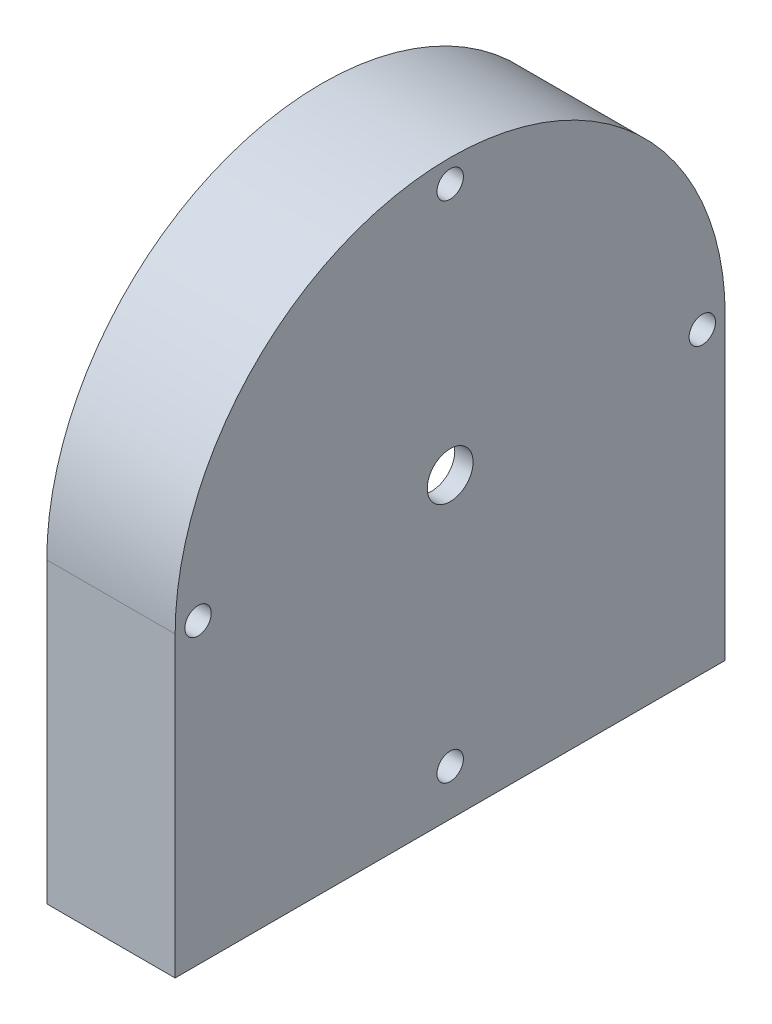
ISO-10303-21;
HEADER;
FILE_DESCRIPTION(('STEP AP214'),'2;1');
FILE_NAME('part.step','',(''),(''),'','','');
FILE_SCHEMA(('AUTOMOTIVE_DESIGN { 1 0 10303 214 1 1 1 1 }'));
ENDSEC;
DATA;
#1=APPLICATION_CONTEXT('core data for automotive mechanical design processes');
#2=APPLICATION_PROTOCOL_DEFINITION('international standard','automotive_design',2000,#1);
#3=PRODUCT_CONTEXT('',#1,'mechanical');
#4=PRODUCT('Part','Part','',(#3));
#5=PRODUCT_RELATED_PRODUCT_CATEGORY('part','',(#4));
#6=PRODUCT_DEFINITION_FORMATION('','',#4);
#7=PRODUCT_DEFINITION_CONTEXT('part definition',#1,'design');
#8=PRODUCT_DEFINITION('design','',#6,#7);
#9=PRODUCT_DEFINITION_SHAPE('','',#8);
#10=(LENGTH_UNIT() NAMED_UNIT(*) SI_UNIT(.MILLI.,.METRE.));
#11=(NAMED_UNIT(*) PLANE_ANGLE_UNIT() SI_UNIT($,.RADIAN.));
#12=(NAMED_UNIT(*) SI_UNIT($,.STERADIAN.) SOLID_ANGLE_UNIT());
#13=UNCERTAINTY_MEASURE_WITH_UNIT(LENGTH_MEASURE(1.E-05),#10,'distance_accuracy_value','');
#14=(GEOMETRIC_REPRESENTATION_CONTEXT(3) GLOBAL_UNCERTAINTY_ASSIGNED_CONTEXT((#13)) GLOBAL_UNIT_ASSIGNED_CONTEXT((#10,
#11,#12)) REPRESENTATION_CONTEXT('',''));
#15=CARTESIAN_POINT('',(0.,0.,0.));
#16=DIRECTION('',(0.,0.,1.));
#17=DIRECTION('',(1.,0.,0.));
#18=AXIS2_PLACEMENT_3D('',#15,#16,#17);
#19=CARTESIAN_POINT('',(17.78,0.,-38.1));
#20=DIRECTION('',(0.,0.,1.));
#21=DIRECTION('',(0.,-1.,0.));
#22=AXIS2_PLACEMENT_3D('',#19,#20,#21);
#23=PLANE('',#22);
#24=DIRECTION('',(0.,1.,0.));
#25=VECTOR('',#24,1.);
#26=CARTESIAN_POINT('',(0.,0.,-38.1));
#27=LINE('',#26,#25);
#28=CARTESIAN_POINT('',(0.,-41.275,-38.1));
#29=VERTEX_POINT('',#28);
#30=CARTESIAN_POINT('',(0.,0.,-38.1));
#31=VERTEX_POINT('',#30);
#32=EDGE_CURVE('E152',#29,#31,#27,.T.);
#33=ORIENTED_EDGE('',*,*,#32,.T.);
#34=DIRECTION('',(-1.,0.,0.));
#35=VECTOR('',#34,1.);
#36=CARTESIAN_POINT('',(17.78,0.,-38.1));
#37=LINE('',#36,#35);
#38=CARTESIAN_POINT('',(17.78,0.,-38.1));
#39=VERTEX_POINT('',#38);
#40=EDGE_CURVE('E11',#39,#31,#37,.T.);
#41=ORIENTED_EDGE('',*,*,#40,.F.);
#42=DIRECTION('',(0.,1.,0.));
#43=VECTOR('',#42,1.);
#44=CARTESIAN_POINT('',(17.78,0.,-38.1));
#45=LINE('',#44,#43);
#46=CARTESIAN_POINT('',(17.78,-41.275,-38.1));
#47=VERTEX_POINT('',#46);
#48=EDGE_CURVE('E155',#47,#39,#45,.T.);
#49=ORIENTED_EDGE('',*,*,#48,.F.);
#50=DIRECTION('',(-1.,0.,0.));
#51=VECTOR('',#50,1.);
#52=CARTESIAN_POINT('',(17.78,-41.275,-38.1));
#53=LINE('',#52,#51);
#54=EDGE_CURVE('E161',#47,#29,#53,.T.);
#55=ORIENTED_EDGE('',*,*,#54,.T.);
#56=EDGE_LOOP('',(#33,#41,#49,#55));
#57=FACE_BOUND('',#56,.T.);
#58=ADVANCED_FACE('F39',(#57),#23,.F.);
#59=CARTESIAN_POINT('',(17.78,0.,0.));
#60=DIRECTION('',(-1.,0.,0.));
#61=DIRECTION('',(0.,0.,1.));
#62=AXIS2_PLACEMENT_3D('',#59,#60,#61);
#63=CYLINDRICAL_SURFACE('',#62,38.1);
#64=CARTESIAN_POINT('',(0.,0.,0.));
#65=DIRECTION('',(1.,0.,0.));
#66=DIRECTION('',(0.,0.,-1.));
#67=AXIS2_PLACEMENT_3D('',#64,#65,#66);
#68=CIRCLE('',#67,38.1);
#69=CARTESIAN_POINT('',(0.,0.,38.1));
#70=VERTEX_POINT('',#69);
#71=EDGE_CURVE('E164',#31,#70,#68,.T.);
#72=ORIENTED_EDGE('',*,*,#71,.T.);
#73=DIRECTION('',(-1.,0.,0.));
#74=VECTOR('',#73,1.);
#75=CARTESIAN_POINT('',(17.78,0.,38.1));
#76=LINE('',#75,#74);
#77=CARTESIAN_POINT('',(17.78,0.,38.1));
#78=VERTEX_POINT('',#77);
#79=EDGE_CURVE('E48',#78,#70,#76,.T.);
#80=ORIENTED_EDGE('',*,*,#79,.F.);
#81=CARTESIAN_POINT('',(17.78,0.,0.));
#82=DIRECTION('',(1.,0.,0.));
#83=DIRECTION('',(0.,0.,-1.));
#84=AXIS2_PLACEMENT_3D('',#81,#82,#83);
#85=CIRCLE('',#84,38.1);
#86=EDGE_CURVE('E87',#39,#78,#85,.T.);
#87=ORIENTED_EDGE('',*,*,#86,.F.);
#88=ORIENTED_EDGE('',*,*,#40,.T.);
#89=EDGE_LOOP('',(#72,#80,#87,#88));
#90=FACE_BOUND('',#89,.T.);
#91=ADVANCED_FACE('F192',(#90),#63,.T.);
#92=CARTESIAN_POINT('',(17.78,0.,38.1));
#93=DIRECTION('',(0.,0.,-1.));
#94=DIRECTION('',(0.,1.,0.));
#95=AXIS2_PLACEMENT_3D('',#92,#93,#94);
#96=PLANE('',#95);
#97=DIRECTION('',(0.,-1.,0.));
#98=VECTOR('',#97,1.);
#99=CARTESIAN_POINT('',(0.,0.,38.1));
#100=LINE('',#99,#98);
#101=CARTESIAN_POINT('',(0.,-41.275,38.1));
#102=VERTEX_POINT('',#101);
#103=EDGE_CURVE('E74',#70,#102,#100,.T.);
#104=ORIENTED_EDGE('',*,*,#103,.T.);
#105=DIRECTION('',(-1.,0.,0.));
#106=VECTOR('',#105,1.);
#107=CARTESIAN_POINT('',(17.78,-41.275,38.1));
#108=LINE('',#107,#106);
#109=CARTESIAN_POINT('',(17.78,-41.275,38.1));
#110=VERTEX_POINT('',#109);
#111=EDGE_CURVE('E169',#110,#102,#108,.T.);
#112=ORIENTED_EDGE('',*,*,#111,.F.);
#113=DIRECTION('',(0.,-1.,0.));
#114=VECTOR('',#113,1.);
#115=CARTESIAN_POINT('',(17.78,0.,38.1));
#116=LINE('',#115,#114);
#117=EDGE_CURVE('E158',#78,#110,#116,.T.);
#118=ORIENTED_EDGE('',*,*,#117,.F.);
#119=ORIENTED_EDGE('',*,*,#79,.T.);
#120=EDGE_LOOP('',(#104,#112,#118,#119));
#121=FACE_BOUND('',#120,.T.);
#122=ADVANCED_FACE('F172',(#121),#96,.F.);
#123=CARTESIAN_POINT('',(17.78,-41.275,0.));
#124=DIRECTION('',(0.,1.,0.));
#125=DIRECTION('',(0.,0.,1.));
#126=AXIS2_PLACEMENT_3D('',#123,#124,#125);
#127=PLANE('',#126);
#128=CARTESIAN_POINT('',(8.89,-41.275,-25.4));
#129=DIRECTION('',(0.,-1.,0.));
#130=DIRECTION('',(0.,0.,-1.));
#131=AXIS2_PLACEMENT_3D('',#128,#129,#130);
#132=CIRCLE('',#131,1.8288);
#133=CARTESIAN_POINT('',(8.89,-41.275,-27.2288));
#134=VERTEX_POINT('',#133);
#135=EDGE_CURVE('E105',#134,#134,#132,.T.);
#136=ORIENTED_EDGE('',*,*,#135,.F.);
#137=EDGE_LOOP('',(#136));
#138=FACE_BOUND('',#137,.T.);
#139=CARTESIAN_POINT('',(8.88999999999999,-41.275,25.4));
#140=DIRECTION('',(0.,-1.,0.));
#141=DIRECTION('',(0.,0.,-1.));
#142=AXIS2_PLACEMENT_3D('',#139,#140,#141);
#143=CIRCLE('',#142,1.8288);
#144=CARTESIAN_POINT('',(8.88999999999999,-41.275,23.5712));
#145=VERTEX_POINT('',#144);
#146=EDGE_CURVE('E104',#145,#145,#143,.T.);
#147=ORIENTED_EDGE('',*,*,#146,.F.);
#148=EDGE_LOOP('',(#147));
#149=FACE_BOUND('',#148,.T.);
#150=DIRECTION('',(0.,0.,-1.));
#151=VECTOR('',#150,1.);
#152=CARTESIAN_POINT('',(0.,-41.275,0.));
#153=LINE('',#152,#151);
#154=EDGE_CURVE('E80',#102,#29,#153,.T.);
#155=ORIENTED_EDGE('',*,*,#154,.T.);
#156=ORIENTED_EDGE('',*,*,#54,.F.);
#157=DIRECTION('',(0.,0.,-1.));
#158=VECTOR('',#157,1.);
#159=CARTESIAN_POINT('',(17.78,-41.275,0.));
#160=LINE('',#159,#158);
#161=EDGE_CURVE('E56',#110,#47,#160,.T.);
#162=ORIENTED_EDGE('',*,*,#161,.F.);
#163=ORIENTED_EDGE('',*,*,#111,.T.);
#164=EDGE_LOOP('',(#155,#156,#162,#163));
#165=FACE_BOUND('',#164,.T.);
#166=ADVANCED_FACE('F179',(#138,#149,#165),#127,.F.);
#167=CARTESIAN_POINT('',(17.78,0.,0.));
#168=DIRECTION('',(1.,0.,0.));
#169=DIRECTION('',(0.,0.,-1.));
#170=AXIS2_PLACEMENT_3D('',#167,#168,#169);
#171=PLANE('',#170);
#172=CARTESIAN_POINT('',(17.78,0.,0.));
#173=DIRECTION('',(1.,0.,0.));
#174=DIRECTION('',(0.,0.,-1.));
#175=AXIS2_PLACEMENT_3D('',#172,#173,#174);
#176=CIRCLE('',#175,3.175);
#177=CARTESIAN_POINT('',(17.78,0.,-3.175));
#178=VERTEX_POINT('',#177);
#179=EDGE_CURVE('E115',#178,#178,#176,.T.);
#180=ORIENTED_EDGE('',*,*,#179,.F.);
#181=EDGE_LOOP('',(#180));
#182=FACE_BOUND('',#181,.T.);
#183=CARTESIAN_POINT('',(17.78,34.925,0.));
#184=DIRECTION('',(1.,0.,0.));
#185=DIRECTION('',(0.,0.,-1.));
#186=AXIS2_PLACEMENT_3D('',#183,#184,#185);
#187=CIRCLE('',#186,1.8288);
#188=CARTESIAN_POINT('',(17.78,34.925,-1.8288));
#189=VERTEX_POINT('',#188);
#190=EDGE_CURVE('E121',#189,#189,#187,.T.);
#191=ORIENTED_EDGE('',*,*,#190,.F.);
#192=EDGE_LOOP('',(#191));
#193=FACE_BOUND('',#192,.T.);
#194=CARTESIAN_POINT('',(17.78,0.,-34.925));
#195=DIRECTION('',(1.,0.,0.));
#196=DIRECTION('',(0.,0.,-1.));
#197=AXIS2_PLACEMENT_3D('',#194,#195,#196);
#198=CIRCLE('',#197,1.8288);
#199=CARTESIAN_POINT('',(17.78,0.,-36.7538));
#200=VERTEX_POINT('',#199);
#201=EDGE_CURVE('E130',#200,#200,#198,.T.);
#202=ORIENTED_EDGE('',*,*,#201,.F.);
#203=EDGE_LOOP('',(#202));
#204=FACE_BOUND('',#203,.T.);
#205=CARTESIAN_POINT('',(17.78,-34.925,0.));
#206=DIRECTION('',(1.,0.,0.));
#207=DIRECTION('',(0.,0.,-1.));
#208=AXIS2_PLACEMENT_3D('',#205,#206,#207);
#209=CIRCLE('',#208,1.8288);
#210=CARTESIAN_POINT('',(17.78,-34.925,-1.8288));
#211=VERTEX_POINT('',#210);
#212=EDGE_CURVE('E136',#211,#211,#209,.T.);
#213=ORIENTED_EDGE('',*,*,#212,.F.);
#214=EDGE_LOOP('',(#213));
#215=FACE_BOUND('',#214,.T.);
#216=CARTESIAN_POINT('',(17.78,0.,34.925));
#217=DIRECTION('',(1.,0.,0.));
#218=DIRECTION('',(0.,0.,-1.));
#219=AXIS2_PLACEMENT_3D('',#216,#217,#218);
#220=CIRCLE('',#219,1.8288);
#221=CARTESIAN_POINT('',(17.78,0.,33.0962));
#222=VERTEX_POINT('',#221);
#223=EDGE_CURVE('E142',#222,#222,#220,.T.);
#224=ORIENTED_EDGE('',*,*,#223,.F.);
#225=EDGE_LOOP('',(#224));
#226=FACE_BOUND('',#225,.T.);
#227=ORIENTED_EDGE('',*,*,#48,.T.);
#228=ORIENTED_EDGE('',*,*,#86,.T.);
#229=ORIENTED_EDGE('',*,*,#117,.T.);
#230=ORIENTED_EDGE('',*,*,#161,.T.);
#231=EDGE_LOOP('',(#227,#228,#229,#230));
#232=FACE_BOUND('',#231,.T.);
#233=ADVANCED_FACE('F181',(#182,#193,#204,#215,#226,#232),#171,.T.);
#234=CARTESIAN_POINT('',(0.,0.,0.));
#235=DIRECTION('',(1.,0.,0.));
#236=DIRECTION('',(0.,0.,-1.));
#237=AXIS2_PLACEMENT_3D('',#234,#235,#236);
#238=PLANE('',#237);
#239=CARTESIAN_POINT('',(0.,34.925,0.));
#240=DIRECTION('',(1.,0.,0.));
#241=DIRECTION('',(0.,0.,-1.));
#242=AXIS2_PLACEMENT_3D('',#239,#240,#241);
#243=CIRCLE('',#242,1.8288);
#244=CARTESIAN_POINT('',(0.,34.925,-1.8288));
#245=VERTEX_POINT('',#244);
#246=EDGE_CURVE('E127',#245,#245,#243,.T.);
#247=ORIENTED_EDGE('',*,*,#246,.T.);
#248=EDGE_LOOP('',(#247));
#249=FACE_BOUND('',#248,.T.);
#250=CARTESIAN_POINT('',(0.,0.,-34.925));
#251=DIRECTION('',(1.,0.,0.));
#252=DIRECTION('',(0.,0.,-1.));
#253=AXIS2_PLACEMENT_3D('',#250,#251,#252);
#254=CIRCLE('',#253,1.8288);
#255=CARTESIAN_POINT('',(0.,0.,-36.7538));
#256=VERTEX_POINT('',#255);
#257=EDGE_CURVE('E133',#256,#256,#254,.T.);
#258=ORIENTED_EDGE('',*,*,#257,.T.);
#259=EDGE_LOOP('',(#258));
#260=FACE_BOUND('',#259,.T.);
#261=CARTESIAN_POINT('',(0.,-34.925,0.));
#262=DIRECTION('',(1.,0.,0.));
#263=DIRECTION('',(0.,0.,-1.));
#264=AXIS2_PLACEMENT_3D('',#261,#262,#263);
#265=CIRCLE('',#264,1.8288);
#266=CARTESIAN_POINT('',(0.,-34.925,-1.8288));
#267=VERTEX_POINT('',#266);
#268=EDGE_CURVE('E139',#267,#267,#265,.T.);
#269=ORIENTED_EDGE('',*,*,#268,.T.);
#270=EDGE_LOOP('',(#269));
#271=FACE_BOUND('',#270,.T.);
#272=CARTESIAN_POINT('',(0.,0.,34.925));
#273=DIRECTION('',(1.,0.,0.));
#274=DIRECTION('',(0.,0.,-1.));
#275=AXIS2_PLACEMENT_3D('',#272,#273,#274);
#276=CIRCLE('',#275,1.8288);
#277=CARTESIAN_POINT('',(0.,0.,33.0962));
#278=VERTEX_POINT('',#277);
#279=EDGE_CURVE('E145',#278,#278,#276,.T.);
#280=ORIENTED_EDGE('',*,*,#279,.T.);
#281=EDGE_LOOP('',(#280));
#282=FACE_BOUND('',#281,.T.);
#283=CARTESIAN_POINT('',(0.,0.,0.));
#284=DIRECTION('',(-1.,0.,0.));
#285=DIRECTION('',(0.,0.,1.));
#286=AXIS2_PLACEMENT_3D('',#283,#284,#285);
#287=CIRCLE('',#286,25.4);
#288=CARTESIAN_POINT('',(0.,0.,25.4));
#289=VERTEX_POINT('',#288);
#290=EDGE_CURVE('E148',#289,#289,#287,.T.);
#291=ORIENTED_EDGE('',*,*,#290,.F.);
#292=EDGE_LOOP('',(#291));
#293=FACE_BOUND('',#292,.T.);
#294=ORIENTED_EDGE('',*,*,#32,.F.);
#295=ORIENTED_EDGE('',*,*,#154,.F.);
#296=ORIENTED_EDGE('',*,*,#103,.F.);
#297=ORIENTED_EDGE('',*,*,#71,.F.);
#298=EDGE_LOOP('',(#294,#295,#296,#297));
#299=FACE_BOUND('',#298,.T.);
#300=ADVANCED_FACE('F175',(#249,#260,#271,#282,#293,#299),#238,.F.);
#301=CARTESIAN_POINT('',(8.89,0.,0.));
#302=DIRECTION('',(-1.,0.,0.));
#303=DIRECTION('',(0.,0.,1.));
#304=AXIS2_PLACEMENT_3D('',#301,#302,#303);
#305=CYLINDRICAL_SURFACE('',#304,25.4);
#306=CARTESIAN_POINT('',(8.89,0.,0.));
#307=DIRECTION('',(-1.,0.,0.));
#308=DIRECTION('',(0.,0.,1.));
#309=AXIS2_PLACEMENT_3D('',#306,#307,#308);
#310=CIRCLE('',#309,25.4);
#311=CARTESIAN_POINT('',(8.89,0.,25.4));
#312=VERTEX_POINT('',#311);
#313=EDGE_CURVE('E149',#312,#312,#310,.T.);
#314=ORIENTED_EDGE('',*,*,#313,.F.);
#315=EDGE_LOOP('',(#314));
#316=FACE_BOUND('',#315,.T.);
#317=ORIENTED_EDGE('',*,*,#290,.T.);
#318=EDGE_LOOP('',(#317));
#319=FACE_BOUND('',#318,.T.);
#320=ADVANCED_FACE('F225',(#316,#319),#305,.F.);
#321=CARTESIAN_POINT('',(8.89,0.,0.));
#322=DIRECTION('',(-1.,0.,0.));
#323=DIRECTION('',(0.,0.,1.));
#324=AXIS2_PLACEMENT_3D('',#321,#322,#323);
#325=PLANE('',#324);
#326=CARTESIAN_POINT('',(8.89,0.,0.));
#327=DIRECTION('',(-1.,0.,0.));
#328=DIRECTION('',(0.,0.,1.));
#329=AXIS2_PLACEMENT_3D('',#326,#327,#328);
#330=CIRCLE('',#329,14.2875);
#331=CARTESIAN_POINT('',(8.89,0.,14.2875));
#332=VERTEX_POINT('',#331);
#333=EDGE_CURVE('E122',#332,#332,#330,.T.);
#334=ORIENTED_EDGE('',*,*,#333,.F.);
#335=EDGE_LOOP('',(#334));
#336=FACE_BOUND('',#335,.T.);
#337=ORIENTED_EDGE('',*,*,#313,.T.);
#338=EDGE_LOOP('',(#337));
#339=FACE_BOUND('',#338,.T.);
#340=ADVANCED_FACE('F232',(#336,#339),#325,.T.);
#341=CARTESIAN_POINT('',(17.78,0.,34.925));
#342=DIRECTION('',(1.,0.,0.));
#343=DIRECTION('',(0.,0.,-1.));
#344=AXIS2_PLACEMENT_3D('',#341,#342,#343);
#345=CYLINDRICAL_SURFACE('',#344,1.8288);
#346=ORIENTED_EDGE('',*,*,#279,.F.);
#347=EDGE_LOOP('',(#346));
#348=FACE_BOUND('',#347,.T.);
#349=ORIENTED_EDGE('',*,*,#223,.T.);
#350=EDGE_LOOP('',(#349));
#351=FACE_BOUND('',#350,.T.);
#352=ADVANCED_FACE('F240',(#348,#351),#345,.F.);
#353=CARTESIAN_POINT('',(17.78,-34.925,0.));
#354=DIRECTION('',(1.,0.,0.));
#355=DIRECTION('',(0.,0.,-1.));
#356=AXIS2_PLACEMENT_3D('',#353,#354,#355);
#357=CYLINDRICAL_SURFACE('',#356,1.8288);
#358=ORIENTED_EDGE('',*,*,#268,.F.);
#359=EDGE_LOOP('',(#358));
#360=FACE_BOUND('',#359,.T.);
#361=ORIENTED_EDGE('',*,*,#212,.T.);
#362=EDGE_LOOP('',(#361));
#363=FACE_BOUND('',#362,.T.);
#364=ADVANCED_FACE('F248',(#360,#363),#357,.F.);
#365=CARTESIAN_POINT('',(17.78,0.,-34.925));
#366=DIRECTION('',(1.,0.,0.));
#367=DIRECTION('',(0.,0.,-1.));
#368=AXIS2_PLACEMENT_3D('',#365,#366,#367);
#369=CYLINDRICAL_SURFACE('',#368,1.8288);
#370=ORIENTED_EDGE('',*,*,#257,.F.);
#371=EDGE_LOOP('',(#370));
#372=FACE_BOUND('',#371,.T.);
#373=ORIENTED_EDGE('',*,*,#201,.T.);
#374=EDGE_LOOP('',(#373));
#375=FACE_BOUND('',#374,.T.);
#376=ADVANCED_FACE('F256',(#372,#375),#369,.F.);
#377=CARTESIAN_POINT('',(17.78,34.925,0.));
#378=DIRECTION('',(1.,0.,0.));
#379=DIRECTION('',(0.,0.,-1.));
#380=AXIS2_PLACEMENT_3D('',#377,#378,#379);
#381=CYLINDRICAL_SURFACE('',#380,1.8288);
#382=ORIENTED_EDGE('',*,*,#246,.F.);
#383=EDGE_LOOP('',(#382));
#384=FACE_BOUND('',#383,.T.);
#385=ORIENTED_EDGE('',*,*,#190,.T.);
#386=EDGE_LOOP('',(#385));
#387=FACE_BOUND('',#386,.T.);
#388=ADVANCED_FACE('F264',(#384,#387),#381,.F.);
#389=CARTESIAN_POINT('',(15.24,0.,0.));
#390=DIRECTION('',(-1.,0.,0.));
#391=DIRECTION('',(0.,0.,1.));
#392=AXIS2_PLACEMENT_3D('',#389,#390,#391);
#393=CYLINDRICAL_SURFACE('',#392,14.2875);
#394=CARTESIAN_POINT('',(15.24,0.,0.));
#395=DIRECTION('',(-1.,0.,0.));
#396=DIRECTION('',(0.,0.,1.));
#397=AXIS2_PLACEMENT_3D('',#394,#395,#396);
#398=CIRCLE('',#397,14.2875);
#399=CARTESIAN_POINT('',(15.24,0.,14.2875));
#400=VERTEX_POINT('',#399);
#401=EDGE_CURVE('E118',#400,#400,#398,.T.);
#402=ORIENTED_EDGE('',*,*,#401,.F.);
#403=EDGE_LOOP('',(#402));
#404=FACE_BOUND('',#403,.T.);
#405=ORIENTED_EDGE('',*,*,#333,.T.);
#406=EDGE_LOOP('',(#405));
#407=FACE_BOUND('',#406,.T.);
#408=ADVANCED_FACE('F271',(#404,#407),#393,.F.);
#409=CARTESIAN_POINT('',(15.24,0.,0.));
#410=DIRECTION('',(-1.,0.,0.));
#411=DIRECTION('',(0.,0.,1.));
#412=AXIS2_PLACEMENT_3D('',#409,#410,#411);
#413=PLANE('',#412);
#414=CARTESIAN_POINT('',(15.24,0.,0.));
#415=DIRECTION('',(-1.,0.,0.));
#416=DIRECTION('',(0.,0.,1.));
#417=AXIS2_PLACEMENT_3D('',#414,#415,#416);
#418=CIRCLE('',#417,3.175);
#419=CARTESIAN_POINT('',(15.24,0.,3.175));
#420=VERTEX_POINT('',#419);
#421=EDGE_CURVE('E42',#420,#420,#418,.T.);
#422=ORIENTED_EDGE('',*,*,#421,.F.);
#423=EDGE_LOOP('',(#422));
#424=FACE_BOUND('',#423,.T.);
#425=ORIENTED_EDGE('',*,*,#401,.T.);
#426=EDGE_LOOP('',(#425));
#427=FACE_BOUND('',#426,.T.);
#428=ADVANCED_FACE('F278',(#424,#427),#413,.T.);
#429=CARTESIAN_POINT('',(0.,0.,0.));
#430=DIRECTION('',(1.,0.,0.));
#431=DIRECTION('',(0.,0.,-1.));
#432=AXIS2_PLACEMENT_3D('',#429,#430,#431);
#433=CYLINDRICAL_SURFACE('',#432,3.175);
#434=ORIENTED_EDGE('',*,*,#421,.T.);
#435=EDGE_LOOP('',(#434));
#436=FACE_BOUND('',#435,.T.);
#437=ORIENTED_EDGE('',*,*,#179,.T.);
#438=EDGE_LOOP('',(#437));
#439=FACE_BOUND('',#438,.T.);
#440=ADVANCED_FACE('F285',(#436,#439),#433,.F.);
#441=CARTESIAN_POINT('',(8.88999999999999,-28.575,25.4));
#442=DIRECTION('',(0.,-1.,0.));
#443=DIRECTION('',(0.,0.,-1.));
#444=AXIS2_PLACEMENT_3D('',#441,#442,#443);
#445=CONICAL_SURFACE('',#444,1.8288,1.02974425867665);
#446=CARTESIAN_POINT('',(8.88999999999999,-27.4761460999224,25.4));
#447=VERTEX_POINT('',#446);
#448=VERTEX_LOOP('',#447);
#449=FACE_BOUND('',#448,.T.);
#450=CARTESIAN_POINT('',(8.88999999999999,-28.575,25.4));
#451=DIRECTION('',(0.,-1.,0.));
#452=DIRECTION('',(0.,0.,-1.));
#453=AXIS2_PLACEMENT_3D('',#450,#451,#452);
#454=CIRCLE('',#453,1.8288);
#455=CARTESIAN_POINT('',(8.88999999999999,-28.575,23.5712));
#456=VERTEX_POINT('',#455);
#457=EDGE_CURVE('E108',#456,#456,#454,.T.);
#458=ORIENTED_EDGE('',*,*,#457,.T.);
#459=EDGE_LOOP('',(#458));
#460=FACE_BOUND('',#459,.T.);
#461=ADVANCED_FACE('F292',(#449,#460),#445,.F.);
#462=CARTESIAN_POINT('',(8.88999999999999,-41.275,25.4));
#463=DIRECTION('',(0.,-1.,0.));
#464=DIRECTION('',(0.,0.,-1.));
#465=AXIS2_PLACEMENT_3D('',#462,#463,#464);
#466=CYLINDRICAL_SURFACE('',#465,1.8288);
#467=ORIENTED_EDGE('',*,*,#457,.F.);
#468=EDGE_LOOP('',(#467));
#469=FACE_BOUND('',#468,.T.);
#470=ORIENTED_EDGE('',*,*,#146,.T.);
#471=EDGE_LOOP('',(#470));
#472=FACE_BOUND('',#471,.T.);
#473=ADVANCED_FACE('F98',(#469,#472),#466,.F.);
#474=CARTESIAN_POINT('',(8.89,-28.575,-25.4));
#475=DIRECTION('',(0.,-1.,0.));
#476=DIRECTION('',(0.,0.,-1.));
#477=AXIS2_PLACEMENT_3D('',#474,#475,#476);
#478=CONICAL_SURFACE('',#477,1.8288,1.02974425867665);
#479=CARTESIAN_POINT('',(8.88999999999999,-27.4761460999224,-25.4));
#480=VERTEX_POINT('',#479);
#481=VERTEX_LOOP('',#480);
#482=FACE_BOUND('',#481,.T.);
#483=CARTESIAN_POINT('',(8.89,-28.575,-25.4));
#484=DIRECTION('',(0.,-1.,0.));
#485=DIRECTION('',(0.,0.,-1.));
#486=AXIS2_PLACEMENT_3D('',#483,#484,#485);
#487=CIRCLE('',#486,1.8288);
#488=CARTESIAN_POINT('',(8.89,-28.575,-27.2288));
#489=VERTEX_POINT('',#488);
#490=EDGE_CURVE('E102',#489,#489,#487,.T.);
#491=ORIENTED_EDGE('',*,*,#490,.T.);
#492=EDGE_LOOP('',(#491));
#493=FACE_BOUND('',#492,.T.);
#494=ADVANCED_FACE('F94',(#482,#493),#478,.F.);
#495=CARTESIAN_POINT('',(8.89,-41.275,-25.4));
#496=DIRECTION('',(0.,-1.,0.));
#497=DIRECTION('',(0.,0.,-1.));
#498=AXIS2_PLACEMENT_3D('',#495,#496,#497);
#499=CYLINDRICAL_SURFACE('',#498,1.8288);
#500=ORIENTED_EDGE('',*,*,#490,.F.);
#501=EDGE_LOOP('',(#500));
#502=FACE_BOUND('',#501,.T.);
#503=ORIENTED_EDGE('',*,*,#135,.T.);
#504=EDGE_LOOP('',(#503));
#505=FACE_BOUND('',#504,.T.);
#506=ADVANCED_FACE('F97',(#502,#505),#499,.F.);
#507=CLOSED_SHELL('',(#58,#91,#122,#166,#233,#300,#320,#340,#352,#364,#376,#388,#408,#428,#440,
#461,#473,#494,#506));
#508=MANIFOLD_SOLID_BREP('B2',#507);
#509=ADVANCED_BREP_SHAPE_REPRESENTATION('',(#18,#508),#14);
#510=SHAPE_DEFINITION_REPRESENTATION(#9,#509);
ENDSEC;
END-ISO-10303-21;
